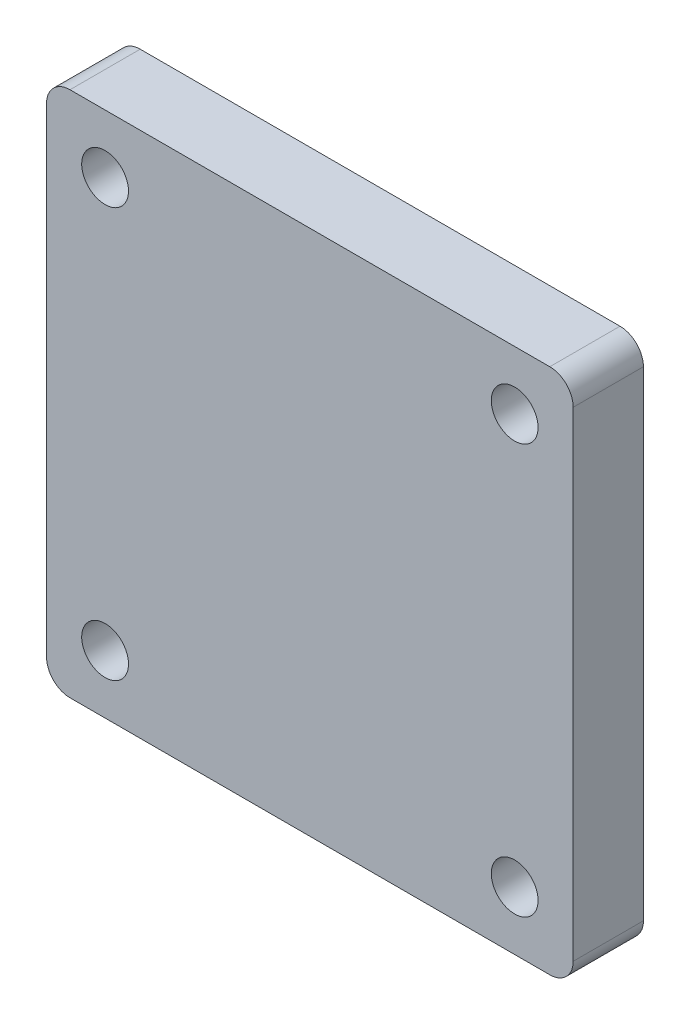
ISO-10303-21;
HEADER;
FILE_DESCRIPTION(('STEP AP214'),'2;1');
FILE_NAME('part.step','',(''),(''),'','','');
FILE_SCHEMA(('AUTOMOTIVE_DESIGN { 1 0 10303 214 1 1 1 1 }'));
ENDSEC;
DATA;
#1=APPLICATION_CONTEXT('core data for automotive mechanical design processes');
#2=APPLICATION_PROTOCOL_DEFINITION('international standard','automotive_design',2000,#1);
#3=PRODUCT_CONTEXT('',#1,'mechanical');
#4=PRODUCT('Part','Part','',(#3));
#5=PRODUCT_RELATED_PRODUCT_CATEGORY('part','',(#4));
#6=PRODUCT_DEFINITION_FORMATION('','',#4);
#7=PRODUCT_DEFINITION_CONTEXT('part definition',#1,'design');
#8=PRODUCT_DEFINITION('design','',#6,#7);
#9=PRODUCT_DEFINITION_SHAPE('','',#8);
#10=(LENGTH_UNIT() NAMED_UNIT(*) SI_UNIT(.MILLI.,.METRE.));
#11=(NAMED_UNIT(*) PLANE_ANGLE_UNIT() SI_UNIT($,.RADIAN.));
#12=(NAMED_UNIT(*) SI_UNIT($,.STERADIAN.) SOLID_ANGLE_UNIT());
#13=UNCERTAINTY_MEASURE_WITH_UNIT(LENGTH_MEASURE(1.E-05),#10,'distance_accuracy_value','');
#14=(GEOMETRIC_REPRESENTATION_CONTEXT(3) GLOBAL_UNCERTAINTY_ASSIGNED_CONTEXT((#13)) GLOBAL_UNIT_ASSIGNED_CONTEXT((#10,
#11,#12)) REPRESENTATION_CONTEXT('',''));
#15=CARTESIAN_POINT('',(0.,0.,0.));
#16=DIRECTION('',(0.,0.,1.));
#17=DIRECTION('',(1.,0.,0.));
#18=AXIS2_PLACEMENT_3D('',#15,#16,#17);
#19=CARTESIAN_POINT('',(0.,0.,3.));
#20=DIRECTION('',(0.,0.,-1.));
#21=DIRECTION('',(-1.,0.,0.));
#22=AXIS2_PLACEMENT_3D('',#19,#20,#21);
#23=PLANE('',#22);
#24=DIRECTION('',(0.,1.,0.));
#25=VECTOR('',#24,1.);
#26=CARTESIAN_POINT('',(22.5,0.,3.));
#27=LINE('',#26,#25);
#28=CARTESIAN_POINT('',(22.5,1.,3.));
#29=VERTEX_POINT('',#28);
#30=CARTESIAN_POINT('',(22.5,21.5,3.));
#31=VERTEX_POINT('',#30);
#32=EDGE_CURVE('E177',#29,#31,#27,.T.);
#33=ORIENTED_EDGE('',*,*,#32,.T.);
#34=CARTESIAN_POINT('',(21.5,21.5,3.));
#35=DIRECTION('',(0.,0.,-1.));
#36=DIRECTION('',(-1.,0.,0.));
#37=AXIS2_PLACEMENT_3D('',#34,#35,#36);
#38=CIRCLE('',#37,1.);
#39=CARTESIAN_POINT('',(21.5,22.5,3.));
#40=VERTEX_POINT('',#39);
#41=EDGE_CURVE('E154',#31,#40,#38,.F.);
#42=ORIENTED_EDGE('',*,*,#41,.T.);
#43=DIRECTION('',(-1.,0.,0.));
#44=VECTOR('',#43,1.);
#45=CARTESIAN_POINT('',(0.,22.5,3.));
#46=LINE('',#45,#44);
#47=CARTESIAN_POINT('',(1.,22.5,3.));
#48=VERTEX_POINT('',#47);
#49=EDGE_CURVE('E125',#40,#48,#46,.T.);
#50=ORIENTED_EDGE('',*,*,#49,.T.);
#51=CARTESIAN_POINT('',(1.,21.5,3.));
#52=DIRECTION('',(0.,0.,-1.));
#53=DIRECTION('',(-1.,0.,0.));
#54=AXIS2_PLACEMENT_3D('',#51,#52,#53);
#55=CIRCLE('',#54,1.);
#56=CARTESIAN_POINT('',(0.,21.5,3.));
#57=VERTEX_POINT('',#56);
#58=EDGE_CURVE('E149',#48,#57,#55,.F.);
#59=ORIENTED_EDGE('',*,*,#58,.T.);
#60=DIRECTION('',(0.,-1.,0.));
#61=VECTOR('',#60,1.);
#62=CARTESIAN_POINT('',(0.,0.,3.));
#63=LINE('',#62,#61);
#64=CARTESIAN_POINT('',(0.,1.,3.));
#65=VERTEX_POINT('',#64);
#66=EDGE_CURVE('E132',#57,#65,#63,.T.);
#67=ORIENTED_EDGE('',*,*,#66,.T.);
#68=CARTESIAN_POINT('',(1.,1.,3.));
#69=DIRECTION('',(0.,0.,-1.));
#70=DIRECTION('',(-1.,0.,0.));
#71=AXIS2_PLACEMENT_3D('',#68,#69,#70);
#72=CIRCLE('',#71,1.);
#73=CARTESIAN_POINT('',(1.,0.,3.));
#74=VERTEX_POINT('',#73);
#75=EDGE_CURVE('E61',#65,#74,#72,.F.);
#76=ORIENTED_EDGE('',*,*,#75,.T.);
#77=DIRECTION('',(1.,0.,0.));
#78=VECTOR('',#77,1.);
#79=CARTESIAN_POINT('',(0.,0.,3.));
#80=LINE('',#79,#78);
#81=CARTESIAN_POINT('',(21.5,0.,3.));
#82=VERTEX_POINT('',#81);
#83=EDGE_CURVE('E135',#74,#82,#80,.T.);
#84=ORIENTED_EDGE('',*,*,#83,.T.);
#85=CARTESIAN_POINT('',(21.5,1.,3.));
#86=DIRECTION('',(0.,0.,-1.));
#87=DIRECTION('',(-1.,0.,0.));
#88=AXIS2_PLACEMENT_3D('',#85,#86,#87);
#89=CIRCLE('',#88,1.);
#90=EDGE_CURVE('E152',#82,#29,#89,.F.);
#91=ORIENTED_EDGE('',*,*,#90,.T.);
#92=EDGE_LOOP('',(#33,#42,#50,#59,#67,#76,#84,#91));
#93=FACE_BOUND('',#92,.T.);
#94=CARTESIAN_POINT('',(2.5,20.,3.));
#95=DIRECTION('',(0.,0.,1.));
#96=DIRECTION('',(1.,0.,0.));
#97=AXIS2_PLACEMENT_3D('',#94,#95,#96);
#98=CIRCLE('',#97,1.);
#99=CARTESIAN_POINT('',(3.5,20.,3.));
#100=VERTEX_POINT('',#99);
#101=EDGE_CURVE('E170',#100,#100,#98,.T.);
#102=ORIENTED_EDGE('',*,*,#101,.F.);
#103=EDGE_LOOP('',(#102));
#104=FACE_BOUND('',#103,.T.);
#105=CARTESIAN_POINT('',(20.,20.,3.));
#106=DIRECTION('',(0.,0.,1.));
#107=DIRECTION('',(1.,0.,0.));
#108=AXIS2_PLACEMENT_3D('',#105,#106,#107);
#109=CIRCLE('',#108,1.);
#110=CARTESIAN_POINT('',(21.,20.,3.));
#111=VERTEX_POINT('',#110);
#112=EDGE_CURVE('E182',#111,#111,#109,.T.);
#113=ORIENTED_EDGE('',*,*,#112,.F.);
#114=EDGE_LOOP('',(#113));
#115=FACE_BOUND('',#114,.T.);
#116=CARTESIAN_POINT('',(20.,2.5,3.));
#117=DIRECTION('',(0.,0.,1.));
#118=DIRECTION('',(1.,0.,0.));
#119=AXIS2_PLACEMENT_3D('',#116,#117,#118);
#120=CIRCLE('',#119,1.);
#121=CARTESIAN_POINT('',(21.,2.5,3.));
#122=VERTEX_POINT('',#121);
#123=EDGE_CURVE('E187',#122,#122,#120,.T.);
#124=ORIENTED_EDGE('',*,*,#123,.F.);
#125=EDGE_LOOP('',(#124));
#126=FACE_BOUND('',#125,.T.);
#127=CARTESIAN_POINT('',(2.5,2.5,3.));
#128=DIRECTION('',(0.,0.,1.));
#129=DIRECTION('',(1.,0.,0.));
#130=AXIS2_PLACEMENT_3D('',#127,#128,#129);
#131=CIRCLE('',#130,1.);
#132=CARTESIAN_POINT('',(3.5,2.5,3.));
#133=VERTEX_POINT('',#132);
#134=EDGE_CURVE('E193',#133,#133,#131,.T.);
#135=ORIENTED_EDGE('',*,*,#134,.F.);
#136=EDGE_LOOP('',(#135));
#137=FACE_BOUND('',#136,.T.);
#138=ADVANCED_FACE('F39',(#93,#104,#115,#126,#137),#23,.F.);
#139=CARTESIAN_POINT('',(0.,0.,0.));
#140=DIRECTION('',(0.,0.,-1.));
#141=DIRECTION('',(-1.,0.,0.));
#142=AXIS2_PLACEMENT_3D('',#139,#140,#141);
#143=PLANE('',#142);
#144=CARTESIAN_POINT('',(20.,2.5,0.));
#145=DIRECTION('',(0.,0.,1.));
#146=DIRECTION('',(1.,0.,0.));
#147=AXIS2_PLACEMENT_3D('',#144,#145,#146);
#148=CIRCLE('',#147,1.);
#149=CARTESIAN_POINT('',(21.,2.5,0.));
#150=VERTEX_POINT('',#149);
#151=EDGE_CURVE('E190',#150,#150,#148,.T.);
#152=ORIENTED_EDGE('',*,*,#151,.T.);
#153=EDGE_LOOP('',(#152));
#154=FACE_BOUND('',#153,.T.);
#155=CARTESIAN_POINT('',(2.5,20.,0.));
#156=DIRECTION('',(0.,0.,1.));
#157=DIRECTION('',(1.,0.,0.));
#158=AXIS2_PLACEMENT_3D('',#155,#156,#157);
#159=CIRCLE('',#158,1.);
#160=CARTESIAN_POINT('',(3.5,20.,0.));
#161=VERTEX_POINT('',#160);
#162=EDGE_CURVE('E173',#161,#161,#159,.T.);
#163=ORIENTED_EDGE('',*,*,#162,.T.);
#164=EDGE_LOOP('',(#163));
#165=FACE_BOUND('',#164,.T.);
#166=DIRECTION('',(-1.,0.,0.));
#167=VECTOR('',#166,1.);
#168=CARTESIAN_POINT('',(0.,22.5,0.));
#169=LINE('',#168,#167);
#170=CARTESIAN_POINT('',(21.5,22.5,0.));
#171=VERTEX_POINT('',#170);
#172=CARTESIAN_POINT('',(1.,22.5,0.));
#173=VERTEX_POINT('',#172);
#174=EDGE_CURVE('E122',#171,#173,#169,.T.);
#175=ORIENTED_EDGE('',*,*,#174,.F.);
#176=CARTESIAN_POINT('',(21.5,21.5,0.));
#177=DIRECTION('',(0.,0.,-1.));
#178=DIRECTION('',(-1.,0.,0.));
#179=AXIS2_PLACEMENT_3D('',#176,#177,#178);
#180=CIRCLE('',#179,1.);
#181=CARTESIAN_POINT('',(22.5,21.5,0.));
#182=VERTEX_POINT('',#181);
#183=EDGE_CURVE('E105',#171,#182,#180,.T.);
#184=ORIENTED_EDGE('',*,*,#183,.T.);
#185=DIRECTION('',(0.,1.,0.));
#186=VECTOR('',#185,1.);
#187=CARTESIAN_POINT('',(22.5,0.,0.));
#188=LINE('',#187,#186);
#189=CARTESIAN_POINT('',(22.5,1.,0.));
#190=VERTEX_POINT('',#189);
#191=EDGE_CURVE('E133',#190,#182,#188,.T.);
#192=ORIENTED_EDGE('',*,*,#191,.F.);
#193=CARTESIAN_POINT('',(21.5,1.,0.));
#194=DIRECTION('',(0.,0.,-1.));
#195=DIRECTION('',(-1.,0.,0.));
#196=AXIS2_PLACEMENT_3D('',#193,#194,#195);
#197=CIRCLE('',#196,1.);
#198=CARTESIAN_POINT('',(21.5,0.,0.));
#199=VERTEX_POINT('',#198);
#200=EDGE_CURVE('E116',#190,#199,#197,.T.);
#201=ORIENTED_EDGE('',*,*,#200,.T.);
#202=DIRECTION('',(1.,0.,0.));
#203=VECTOR('',#202,1.);
#204=CARTESIAN_POINT('',(0.,0.,0.));
#205=LINE('',#204,#203);
#206=CARTESIAN_POINT('',(1.,0.,0.));
#207=VERTEX_POINT('',#206);
#208=EDGE_CURVE('E137',#207,#199,#205,.T.);
#209=ORIENTED_EDGE('',*,*,#208,.F.);
#210=CARTESIAN_POINT('',(1.,1.,0.));
#211=DIRECTION('',(0.,0.,-1.));
#212=DIRECTION('',(-1.,0.,0.));
#213=AXIS2_PLACEMENT_3D('',#210,#211,#212);
#214=CIRCLE('',#213,1.);
#215=CARTESIAN_POINT('',(0.,1.,0.));
#216=VERTEX_POINT('',#215);
#217=EDGE_CURVE('E143',#207,#216,#214,.T.);
#218=ORIENTED_EDGE('',*,*,#217,.T.);
#219=DIRECTION('',(0.,-1.,0.));
#220=VECTOR('',#219,1.);
#221=CARTESIAN_POINT('',(0.,0.,0.));
#222=LINE('',#221,#220);
#223=CARTESIAN_POINT('',(0.,21.5,0.));
#224=VERTEX_POINT('',#223);
#225=EDGE_CURVE('E165',#224,#216,#222,.T.);
#226=ORIENTED_EDGE('',*,*,#225,.F.);
#227=CARTESIAN_POINT('',(1.,21.5,0.));
#228=DIRECTION('',(0.,0.,-1.));
#229=DIRECTION('',(-1.,0.,0.));
#230=AXIS2_PLACEMENT_3D('',#227,#228,#229);
#231=CIRCLE('',#230,1.);
#232=EDGE_CURVE('E126',#224,#173,#231,.T.);
#233=ORIENTED_EDGE('',*,*,#232,.T.);
#234=EDGE_LOOP('',(#175,#184,#192,#201,#209,#218,#226,#233));
#235=FACE_BOUND('',#234,.T.);
#236=CARTESIAN_POINT('',(20.,20.,0.));
#237=DIRECTION('',(0.,0.,1.));
#238=DIRECTION('',(1.,0.,0.));
#239=AXIS2_PLACEMENT_3D('',#236,#237,#238);
#240=CIRCLE('',#239,1.);
#241=CARTESIAN_POINT('',(21.,20.,0.));
#242=VERTEX_POINT('',#241);
#243=EDGE_CURVE('E184',#242,#242,#240,.T.);
#244=ORIENTED_EDGE('',*,*,#243,.T.);
#245=EDGE_LOOP('',(#244));
#246=FACE_BOUND('',#245,.T.);
#247=CARTESIAN_POINT('',(2.5,2.5,0.));
#248=DIRECTION('',(0.,0.,1.));
#249=DIRECTION('',(1.,0.,0.));
#250=AXIS2_PLACEMENT_3D('',#247,#248,#249);
#251=CIRCLE('',#250,1.);
#252=CARTESIAN_POINT('',(3.5,2.5,0.));
#253=VERTEX_POINT('',#252);
#254=EDGE_CURVE('E196',#253,#253,#251,.T.);
#255=ORIENTED_EDGE('',*,*,#254,.T.);
#256=EDGE_LOOP('',(#255));
#257=FACE_BOUND('',#256,.T.);
#258=ADVANCED_FACE('F129',(#154,#165,#235,#246,#257),#143,.T.);
#259=CARTESIAN_POINT('',(0.,0.,3.));
#260=DIRECTION('',(1.,0.,0.));
#261=DIRECTION('',(0.,0.,-1.));
#262=AXIS2_PLACEMENT_3D('',#259,#260,#261);
#263=PLANE('',#262);
#264=ORIENTED_EDGE('',*,*,#225,.T.);
#265=DIRECTION('',(0.,0.,-1.));
#266=VECTOR('',#265,1.);
#267=CARTESIAN_POINT('',(0.,1.,3.));
#268=LINE('',#267,#266);
#269=EDGE_CURVE('E11',#216,#65,#268,.F.);
#270=ORIENTED_EDGE('',*,*,#269,.T.);
#271=ORIENTED_EDGE('',*,*,#66,.F.);
#272=DIRECTION('',(0.,0.,-1.));
#273=VECTOR('',#272,1.);
#274=CARTESIAN_POINT('',(0.,21.5,3.));
#275=LINE('',#274,#273);
#276=EDGE_CURVE('E47',#57,#224,#275,.T.);
#277=ORIENTED_EDGE('',*,*,#276,.T.);
#278=EDGE_LOOP('',(#264,#270,#271,#277));
#279=FACE_BOUND('',#278,.T.);
#280=ADVANCED_FACE('F164',(#279),#263,.F.);
#281=CARTESIAN_POINT('',(0.,0.,3.));
#282=DIRECTION('',(0.,1.,0.));
#283=DIRECTION('',(0.,0.,1.));
#284=AXIS2_PLACEMENT_3D('',#281,#282,#283);
#285=PLANE('',#284);
#286=ORIENTED_EDGE('',*,*,#208,.T.);
#287=DIRECTION('',(0.,0.,-1.));
#288=VECTOR('',#287,1.);
#289=CARTESIAN_POINT('',(21.5,0.,3.));
#290=LINE('',#289,#288);
#291=EDGE_CURVE('E54',#199,#82,#290,.F.);
#292=ORIENTED_EDGE('',*,*,#291,.T.);
#293=ORIENTED_EDGE('',*,*,#83,.F.);
#294=DIRECTION('',(0.,0.,-1.));
#295=VECTOR('',#294,1.);
#296=CARTESIAN_POINT('',(1.,0.,3.));
#297=LINE('',#296,#295);
#298=EDGE_CURVE('E156',#74,#207,#297,.T.);
#299=ORIENTED_EDGE('',*,*,#298,.T.);
#300=EDGE_LOOP('',(#286,#292,#293,#299));
#301=FACE_BOUND('',#300,.T.);
#302=ADVANCED_FACE('F223',(#301),#285,.F.);
#303=CARTESIAN_POINT('',(22.5,0.,3.));
#304=DIRECTION('',(-1.,0.,0.));
#305=DIRECTION('',(0.,0.,1.));
#306=AXIS2_PLACEMENT_3D('',#303,#304,#305);
#307=PLANE('',#306);
#308=ORIENTED_EDGE('',*,*,#191,.T.);
#309=DIRECTION('',(0.,0.,-1.));
#310=VECTOR('',#309,1.);
#311=CARTESIAN_POINT('',(22.5,21.5,3.));
#312=LINE('',#311,#310);
#313=EDGE_CURVE('E110',#182,#31,#312,.F.);
#314=ORIENTED_EDGE('',*,*,#313,.T.);
#315=ORIENTED_EDGE('',*,*,#32,.F.);
#316=DIRECTION('',(0.,0.,-1.));
#317=VECTOR('',#316,1.);
#318=CARTESIAN_POINT('',(22.5,1.,3.));
#319=LINE('',#318,#317);
#320=EDGE_CURVE('E115',#29,#190,#319,.T.);
#321=ORIENTED_EDGE('',*,*,#320,.T.);
#322=EDGE_LOOP('',(#308,#314,#315,#321));
#323=FACE_BOUND('',#322,.T.);
#324=ADVANCED_FACE('F220',(#323),#307,.F.);
#325=CARTESIAN_POINT('',(0.,22.5,3.));
#326=DIRECTION('',(0.,-1.,0.));
#327=DIRECTION('',(0.,0.,-1.));
#328=AXIS2_PLACEMENT_3D('',#325,#326,#327);
#329=PLANE('',#328);
#330=ORIENTED_EDGE('',*,*,#49,.F.);
#331=DIRECTION('',(0.,0.,-1.));
#332=VECTOR('',#331,1.);
#333=CARTESIAN_POINT('',(21.5,22.5,3.));
#334=LINE('',#333,#332);
#335=EDGE_CURVE('E109',#40,#171,#334,.T.);
#336=ORIENTED_EDGE('',*,*,#335,.T.);
#337=ORIENTED_EDGE('',*,*,#174,.T.);
#338=DIRECTION('',(0.,0.,-1.));
#339=VECTOR('',#338,1.);
#340=CARTESIAN_POINT('',(1.,22.5,3.));
#341=LINE('',#340,#339);
#342=EDGE_CURVE('E127',#173,#48,#341,.F.);
#343=ORIENTED_EDGE('',*,*,#342,.T.);
#344=EDGE_LOOP('',(#330,#336,#337,#343));
#345=FACE_BOUND('',#344,.T.);
#346=ADVANCED_FACE('F121',(#345),#329,.F.);
#347=CARTESIAN_POINT('',(2.5,20.,3.));
#348=DIRECTION('',(0.,0.,-1.));
#349=DIRECTION('',(-1.,0.,0.));
#350=AXIS2_PLACEMENT_3D('',#347,#348,#349);
#351=CYLINDRICAL_SURFACE('',#350,1.);
#352=ORIENTED_EDGE('',*,*,#101,.T.);
#353=EDGE_LOOP('',(#352));
#354=FACE_BOUND('',#353,.T.);
#355=ORIENTED_EDGE('',*,*,#162,.F.);
#356=EDGE_LOOP('',(#355));
#357=FACE_BOUND('',#356,.T.);
#358=ADVANCED_FACE('F215',(#354,#357),#351,.F.);
#359=CARTESIAN_POINT('',(20.,20.,3.));
#360=DIRECTION('',(0.,0.,-1.));
#361=DIRECTION('',(-1.,0.,0.));
#362=AXIS2_PLACEMENT_3D('',#359,#360,#361);
#363=CYLINDRICAL_SURFACE('',#362,1.);
#364=ORIENTED_EDGE('',*,*,#112,.T.);
#365=EDGE_LOOP('',(#364));
#366=FACE_BOUND('',#365,.T.);
#367=ORIENTED_EDGE('',*,*,#243,.F.);
#368=EDGE_LOOP('',(#367));
#369=FACE_BOUND('',#368,.T.);
#370=ADVANCED_FACE('F280',(#366,#369),#363,.F.);
#371=CARTESIAN_POINT('',(20.,2.5,3.));
#372=DIRECTION('',(0.,0.,-1.));
#373=DIRECTION('',(-1.,0.,0.));
#374=AXIS2_PLACEMENT_3D('',#371,#372,#373);
#375=CYLINDRICAL_SURFACE('',#374,1.);
#376=ORIENTED_EDGE('',*,*,#123,.T.);
#377=EDGE_LOOP('',(#376));
#378=FACE_BOUND('',#377,.T.);
#379=ORIENTED_EDGE('',*,*,#151,.F.);
#380=EDGE_LOOP('',(#379));
#381=FACE_BOUND('',#380,.T.);
#382=ADVANCED_FACE('F271',(#378,#381),#375,.F.);
#383=CARTESIAN_POINT('',(2.5,2.5,3.));
#384=DIRECTION('',(0.,0.,-1.));
#385=DIRECTION('',(-1.,0.,0.));
#386=AXIS2_PLACEMENT_3D('',#383,#384,#385);
#387=CYLINDRICAL_SURFACE('',#386,1.);
#388=ORIENTED_EDGE('',*,*,#134,.T.);
#389=EDGE_LOOP('',(#388));
#390=FACE_BOUND('',#389,.T.);
#391=ORIENTED_EDGE('',*,*,#254,.F.);
#392=EDGE_LOOP('',(#391));
#393=FACE_BOUND('',#392,.T.);
#394=ADVANCED_FACE('F202',(#390,#393),#387,.F.);
#395=CARTESIAN_POINT('',(21.5,21.5,3.));
#396=DIRECTION('',(0.,0.,-1.));
#397=DIRECTION('',(-1.,0.,0.));
#398=AXIS2_PLACEMENT_3D('',#395,#396,#397);
#399=CYLINDRICAL_SURFACE('',#398,1.);
#400=ORIENTED_EDGE('',*,*,#41,.F.);
#401=ORIENTED_EDGE('',*,*,#313,.F.);
#402=ORIENTED_EDGE('',*,*,#183,.F.);
#403=ORIENTED_EDGE('',*,*,#335,.F.);
#404=EDGE_LOOP('',(#400,#401,#402,#403));
#405=FACE_BOUND('',#404,.T.);
#406=ADVANCED_FACE('F108',(#405),#399,.T.);
#407=CARTESIAN_POINT('',(21.5,1.,3.));
#408=DIRECTION('',(0.,0.,-1.));
#409=DIRECTION('',(-1.,0.,0.));
#410=AXIS2_PLACEMENT_3D('',#407,#408,#409);
#411=CYLINDRICAL_SURFACE('',#410,1.);
#412=ORIENTED_EDGE('',*,*,#90,.F.);
#413=ORIENTED_EDGE('',*,*,#291,.F.);
#414=ORIENTED_EDGE('',*,*,#200,.F.);
#415=ORIENTED_EDGE('',*,*,#320,.F.);
#416=EDGE_LOOP('',(#412,#413,#414,#415));
#417=FACE_BOUND('',#416,.T.);
#418=ADVANCED_FACE('F231',(#417),#411,.T.);
#419=CARTESIAN_POINT('',(1.,1.,3.));
#420=DIRECTION('',(0.,0.,-1.));
#421=DIRECTION('',(-1.,0.,0.));
#422=AXIS2_PLACEMENT_3D('',#419,#420,#421);
#423=CYLINDRICAL_SURFACE('',#422,1.);
#424=ORIENTED_EDGE('',*,*,#75,.F.);
#425=ORIENTED_EDGE('',*,*,#269,.F.);
#426=ORIENTED_EDGE('',*,*,#217,.F.);
#427=ORIENTED_EDGE('',*,*,#298,.F.);
#428=EDGE_LOOP('',(#424,#425,#426,#427));
#429=FACE_BOUND('',#428,.T.);
#430=ADVANCED_FACE('F233',(#429),#423,.T.);
#431=CARTESIAN_POINT('',(1.,21.5,3.));
#432=DIRECTION('',(0.,0.,-1.));
#433=DIRECTION('',(-1.,0.,0.));
#434=AXIS2_PLACEMENT_3D('',#431,#432,#433);
#435=CYLINDRICAL_SURFACE('',#434,1.);
#436=ORIENTED_EDGE('',*,*,#58,.F.);
#437=ORIENTED_EDGE('',*,*,#342,.F.);
#438=ORIENTED_EDGE('',*,*,#232,.F.);
#439=ORIENTED_EDGE('',*,*,#276,.F.);
#440=EDGE_LOOP('',(#436,#437,#438,#439));
#441=FACE_BOUND('',#440,.T.);
#442=ADVANCED_FACE('F41',(#441),#435,.T.);
#443=CLOSED_SHELL('',(#138,#258,#280,#302,#324,#346,#358,#370,#382,#394,#406,#418,#430,#442));
#444=MANIFOLD_SOLID_BREP('B2',#443);
#445=ADVANCED_BREP_SHAPE_REPRESENTATION('',(#18,#444),#14);
#446=SHAPE_DEFINITION_REPRESENTATION(#9,#445);
ENDSEC;
END-ISO-10303-21;
